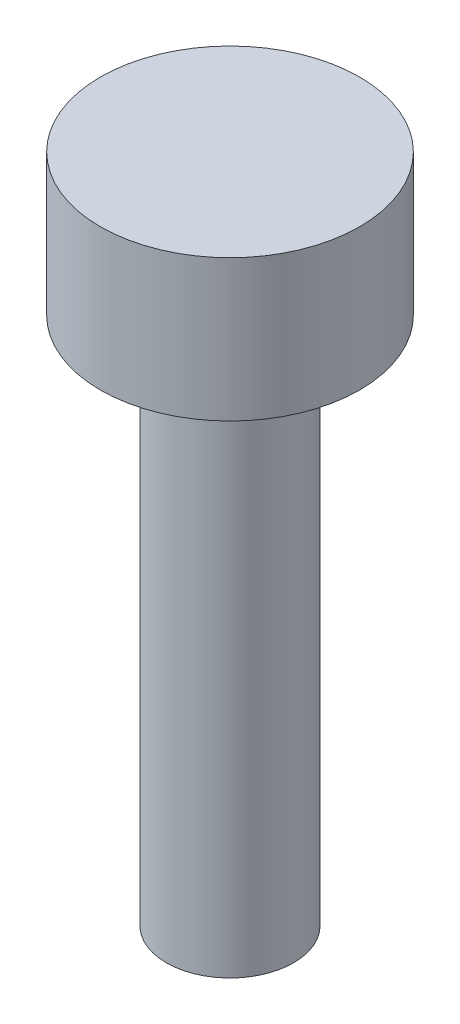
ISO-10303-21;
HEADER;
FILE_DESCRIPTION(('STEP AP214'),'2;1');
FILE_NAME('part.step','',(''),(''),'','','');
FILE_SCHEMA(('AUTOMOTIVE_DESIGN { 1 0 10303 214 1 1 1 1 }'));
ENDSEC;
DATA;
#1=APPLICATION_CONTEXT('core data for automotive mechanical design processes');
#2=APPLICATION_PROTOCOL_DEFINITION('international standard','automotive_design',2000,#1);
#3=PRODUCT_CONTEXT('',#1,'mechanical');
#4=PRODUCT('Part','Part','',(#3));
#5=PRODUCT_RELATED_PRODUCT_CATEGORY('part','',(#4));
#6=PRODUCT_DEFINITION_FORMATION('','',#4);
#7=PRODUCT_DEFINITION_CONTEXT('part definition',#1,'design');
#8=PRODUCT_DEFINITION('design','',#6,#7);
#9=PRODUCT_DEFINITION_SHAPE('','',#8);
#10=(LENGTH_UNIT() NAMED_UNIT(*) SI_UNIT(.MILLI.,.METRE.));
#11=(NAMED_UNIT(*) PLANE_ANGLE_UNIT() SI_UNIT($,.RADIAN.));
#12=(NAMED_UNIT(*) SI_UNIT($,.STERADIAN.) SOLID_ANGLE_UNIT());
#13=UNCERTAINTY_MEASURE_WITH_UNIT(LENGTH_MEASURE(1.E-05),#10,'distance_accuracy_value','');
#14=(GEOMETRIC_REPRESENTATION_CONTEXT(3) GLOBAL_UNCERTAINTY_ASSIGNED_CONTEXT((#13)) GLOBAL_UNIT_ASSIGNED_CONTEXT((#10,
#11,#12)) REPRESENTATION_CONTEXT('',''));
#15=CARTESIAN_POINT('',(0.,0.,0.));
#16=DIRECTION('',(0.,0.,1.));
#17=DIRECTION('',(1.,0.,0.));
#18=AXIS2_PLACEMENT_3D('',#15,#16,#17);
#19=CARTESIAN_POINT('',(0.,15.,2.75));
#20=DIRECTION('',(0.,1.,0.));
#21=DIRECTION('',(0.,0.,1.));
#22=AXIS2_PLACEMENT_3D('',#19,#20,#21);
#23=PLANE('',#22);
#24=CARTESIAN_POINT('',(0.,15.,0.));
#25=DIRECTION('',(0.,1.,0.));
#26=DIRECTION('',(0.,0.,1.));
#27=AXIS2_PLACEMENT_3D('',#24,#25,#26);
#28=CIRCLE('',#27,2.75);
#29=CARTESIAN_POINT('',(0.,15.,2.75));
#30=VERTEX_POINT('',#29);
#31=EDGE_CURVE('E20',#30,#30,#28,.F.);
#32=ORIENTED_EDGE('',*,*,#31,.F.);
#33=EDGE_LOOP('',(#32));
#34=FACE_BOUND('',#33,.T.);
#35=ADVANCED_FACE('F17',(#34),#23,.T.);
#36=CARTESIAN_POINT('',(0.,7.5,0.));
#37=DIRECTION('',(0.,1.,0.));
#38=DIRECTION('',(0.,0.,1.));
#39=AXIS2_PLACEMENT_3D('',#36,#37,#38);
#40=CYLINDRICAL_SURFACE('',#39,2.75);
#41=CARTESIAN_POINT('',(0.,12.,0.));
#42=DIRECTION('',(0.,1.,0.));
#43=DIRECTION('',(0.,0.,1.));
#44=AXIS2_PLACEMENT_3D('',#41,#42,#43);
#45=CIRCLE('',#44,2.75);
#46=CARTESIAN_POINT('',(0.,12.,2.75));
#47=VERTEX_POINT('',#46);
#48=EDGE_CURVE('E42',#47,#47,#45,.T.);
#49=ORIENTED_EDGE('',*,*,#48,.T.);
#50=EDGE_LOOP('',(#49));
#51=FACE_BOUND('',#50,.T.);
#52=ORIENTED_EDGE('',*,*,#31,.T.);
#53=EDGE_LOOP('',(#52));
#54=FACE_BOUND('',#53,.T.);
#55=ADVANCED_FACE('F50',(#51,#54),#40,.T.);
#56=CARTESIAN_POINT('',(0.,12.,1.35));
#57=DIRECTION('',(0.,1.,0.));
#58=DIRECTION('',(0.,0.,1.));
#59=AXIS2_PLACEMENT_3D('',#56,#57,#58);
#60=PLANE('',#59);
#61=CARTESIAN_POINT('',(0.,12.,0.));
#62=DIRECTION('',(0.,1.,0.));
#63=DIRECTION('',(0.,0.,1.));
#64=AXIS2_PLACEMENT_3D('',#61,#62,#63);
#65=CIRCLE('',#64,1.35);
#66=CARTESIAN_POINT('',(0.,12.,1.35));
#67=VERTEX_POINT('',#66);
#68=EDGE_CURVE('E24',#67,#67,#65,.F.);
#69=ORIENTED_EDGE('',*,*,#68,.F.);
#70=EDGE_LOOP('',(#69));
#71=FACE_BOUND('',#70,.T.);
#72=ORIENTED_EDGE('',*,*,#48,.F.);
#73=EDGE_LOOP('',(#72));
#74=FACE_BOUND('',#73,.T.);
#75=ADVANCED_FACE('F32',(#71,#74),#60,.F.);
#76=CARTESIAN_POINT('',(0.,0.779422863445234,0.));
#77=DIRECTION('',(0.,1.,0.));
#78=DIRECTION('',(0.,0.,1.));
#79=AXIS2_PLACEMENT_3D('',#76,#77,#78);
#80=CONICAL_SURFACE('',#79,1.35000000002968,1.04719755111197);
#81=CARTESIAN_POINT('',(0.,-5.6843418860808E-11,0.));
#82=VERTEX_POINT('',#81);
#83=VERTEX_LOOP('',#82);
#84=FACE_BOUND('',#83,.T.);
#85=CARTESIAN_POINT('',(0.,0.779422863406,0.));
#86=DIRECTION('',(0.,1.,0.));
#87=DIRECTION('',(0.,0.,1.));
#88=AXIS2_PLACEMENT_3D('',#85,#86,#87);
#89=CIRCLE('',#88,1.35);
#90=CARTESIAN_POINT('',(0.,0.779422863406,1.35));
#91=VERTEX_POINT('',#90);
#92=EDGE_CURVE('E11',#91,#91,#89,.T.);
#93=ORIENTED_EDGE('',*,*,#92,.F.);
#94=EDGE_LOOP('',(#93));
#95=FACE_BOUND('',#94,.T.);
#96=ADVANCED_FACE('F28',(#84,#95),#80,.T.);
#97=CARTESIAN_POINT('',(0.,7.5,0.));
#98=DIRECTION('',(0.,1.,0.));
#99=DIRECTION('',(0.,0.,1.));
#100=AXIS2_PLACEMENT_3D('',#97,#98,#99);
#101=CYLINDRICAL_SURFACE('',#100,1.35);
#102=ORIENTED_EDGE('',*,*,#92,.T.);
#103=EDGE_LOOP('',(#102));
#104=FACE_BOUND('',#103,.T.);
#105=ORIENTED_EDGE('',*,*,#68,.T.);
#106=EDGE_LOOP('',(#105));
#107=FACE_BOUND('',#106,.T.);
#108=ADVANCED_FACE('F31',(#104,#107),#101,.T.);
#109=CLOSED_SHELL('',(#35,#55,#75,#96,#108));
#110=MANIFOLD_SOLID_BREP('B1',#109);
#111=ADVANCED_BREP_SHAPE_REPRESENTATION('',(#18,#110),#14);
#112=SHAPE_DEFINITION_REPRESENTATION(#9,#111);
ENDSEC;
END-ISO-10303-21;
